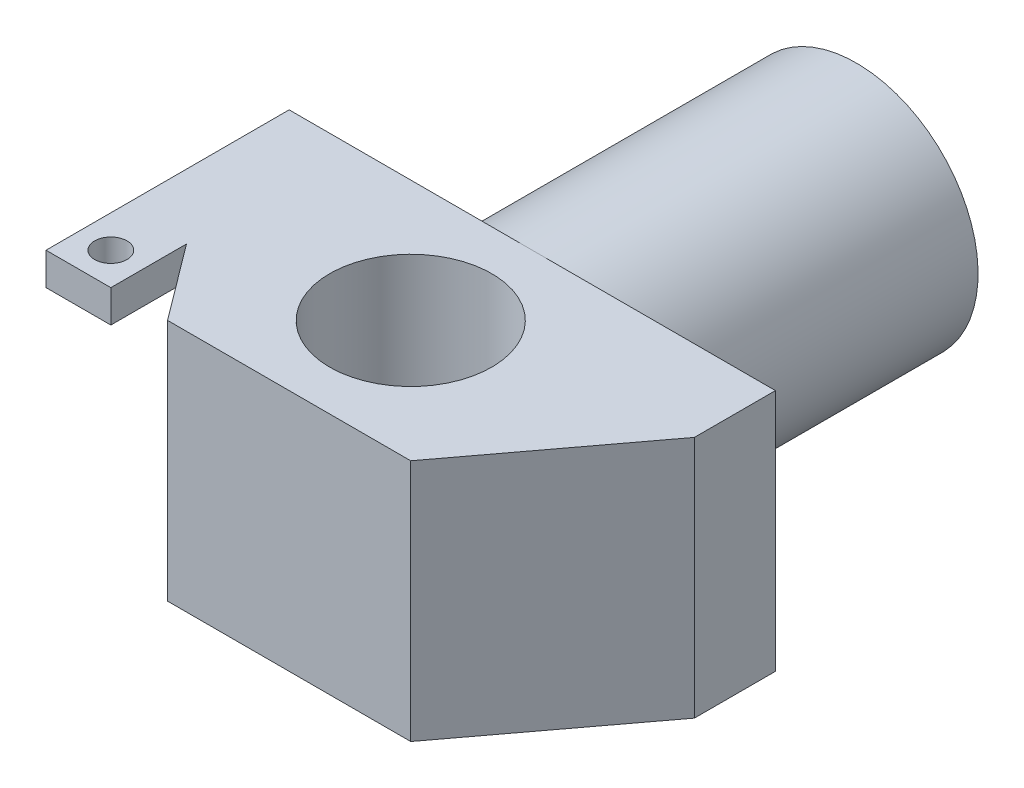
ISO-10303-21;
HEADER;
FILE_DESCRIPTION(('STEP AP214'),'2;1');
FILE_NAME('part.step','',(''),(''),'','','');
FILE_SCHEMA(('AUTOMOTIVE_DESIGN { 1 0 10303 214 1 1 1 1 }'));
ENDSEC;
DATA;
#1=APPLICATION_CONTEXT('core data for automotive mechanical design processes');
#2=APPLICATION_PROTOCOL_DEFINITION('international standard','automotive_design',2000,#1);
#3=PRODUCT_CONTEXT('',#1,'mechanical');
#4=PRODUCT('Part','Part','',(#3));
#5=PRODUCT_RELATED_PRODUCT_CATEGORY('part','',(#4));
#6=PRODUCT_DEFINITION_FORMATION('','',#4);
#7=PRODUCT_DEFINITION_CONTEXT('part definition',#1,'design');
#8=PRODUCT_DEFINITION('design','',#6,#7);
#9=PRODUCT_DEFINITION_SHAPE('','',#8);
#10=(LENGTH_UNIT() NAMED_UNIT(*) SI_UNIT(.MILLI.,.METRE.));
#11=(NAMED_UNIT(*) PLANE_ANGLE_UNIT() SI_UNIT($,.RADIAN.));
#12=(NAMED_UNIT(*) SI_UNIT($,.STERADIAN.) SOLID_ANGLE_UNIT());
#13=UNCERTAINTY_MEASURE_WITH_UNIT(LENGTH_MEASURE(1.E-05),#10,'distance_accuracy_value','');
#14=(GEOMETRIC_REPRESENTATION_CONTEXT(3) GLOBAL_UNCERTAINTY_ASSIGNED_CONTEXT((#13)) GLOBAL_UNIT_ASSIGNED_CONTEXT((#10,
#11,#12)) REPRESENTATION_CONTEXT('',''));
#15=CARTESIAN_POINT('',(0.,0.,0.));
#16=DIRECTION('',(0.,0.,1.));
#17=DIRECTION('',(1.,0.,0.));
#18=AXIS2_PLACEMENT_3D('',#15,#16,#17);
#19=CARTESIAN_POINT('',(-31.902827627041,7.5,23.1720895328567));
#20=DIRECTION('',(0.,0.,1.));
#21=DIRECTION('',(1.,0.,0.));
#22=AXIS2_PLACEMENT_3D('',#19,#20,#21);
#23=PLANE('',#22);
#24=CARTESIAN_POINT('',(-39.402827627041,3.75,23.1720895328567));
#25=DIRECTION('',(0.,0.,-1.));
#26=DIRECTION('',(-1.,0.,0.));
#27=AXIS2_PLACEMENT_3D('',#24,#25,#26);
#28=CIRCLE('',#27,3.75000000000001);
#29=CARTESIAN_POINT('',(-39.402827627041,7.50000000000001,23.1720895328567));
#30=VERTEX_POINT('',#29);
#31=CARTESIAN_POINT('',(-39.402827627041,0.,23.1720895328567));
#32=VERTEX_POINT('',#31);
#33=EDGE_CURVE('E152',#30,#32,#28,.T.);
#34=ORIENTED_EDGE('',*,*,#33,.F.);
#35=DIRECTION('',(-1.,0.,0.));
#36=VECTOR('',#35,1.);
#37=CARTESIAN_POINT('',(-31.902827627041,7.5,23.1720895328567));
#38=LINE('',#37,#36);
#39=CARTESIAN_POINT('',(-31.902827627041,7.5,23.1720895328567));
#40=VERTEX_POINT('',#39);
#41=EDGE_CURVE('E119',#40,#30,#38,.T.);
#42=ORIENTED_EDGE('',*,*,#41,.F.);
#43=DIRECTION('',(0.,-1.,0.));
#44=VECTOR('',#43,1.);
#45=CARTESIAN_POINT('',(-31.902827627041,7.5,23.1720895328567));
#46=LINE('',#45,#44);
#47=CARTESIAN_POINT('',(-31.902827627041,0.,23.1720895328567));
#48=VERTEX_POINT('',#47);
#49=EDGE_CURVE('E192',#40,#48,#46,.T.);
#50=ORIENTED_EDGE('',*,*,#49,.T.);
#51=DIRECTION('',(-1.,0.,0.));
#52=VECTOR('',#51,1.);
#53=CARTESIAN_POINT('',(-31.902827627041,0.,23.1720895328567));
#54=LINE('',#53,#52);
#55=EDGE_CURVE('E184',#48,#32,#54,.T.);
#56=ORIENTED_EDGE('',*,*,#55,.T.);
#57=EDGE_LOOP('',(#34,#42,#50,#56));
#58=FACE_BOUND('',#57,.T.);
#59=ADVANCED_FACE('F33',(#58),#23,.F.);
#60=CARTESIAN_POINT('',(-46.902827627041,0.,23.1720895328567));
#61=VERTEX_POINT('',#60);
#62=EDGE_CURVE('E183',#32,#61,#54,.T.);
#63=ORIENTED_EDGE('',*,*,#62,.T.);
#64=DIRECTION('',(0.,-1.,0.));
#65=VECTOR('',#64,1.);
#66=CARTESIAN_POINT('',(-46.902827627041,7.5,23.1720895328567));
#67=LINE('',#66,#65);
#68=CARTESIAN_POINT('',(-46.902827627041,7.5,23.1720895328567));
#69=VERTEX_POINT('',#68);
#70=EDGE_CURVE('E190',#69,#61,#67,.T.);
#71=ORIENTED_EDGE('',*,*,#70,.F.);
#72=EDGE_CURVE('E114',#30,#69,#38,.T.);
#73=ORIENTED_EDGE('',*,*,#72,.F.);
#74=EDGE_CURVE('E41',#32,#30,#28,.T.);
#75=ORIENTED_EDGE('',*,*,#74,.F.);
#76=EDGE_LOOP('',(#63,#71,#73,#75));
#77=FACE_BOUND('',#76,.T.);
#78=ADVANCED_FACE('F219',(#77),#23,.F.);
#79=CARTESIAN_POINT('',(0.,7.5,0.));
#80=DIRECTION('',(0.,1.,0.));
#81=DIRECTION('',(0.,0.,1.));
#82=AXIS2_PLACEMENT_3D('',#79,#80,#81);
#83=PLANE('',#82);
#84=CARTESIAN_POINT('',(-45.902827627041,7.5,29.6720895328567));
#85=DIRECTION('',(0.,1.,0.));
#86=DIRECTION('',(0.,0.,1.));
#87=AXIS2_PLACEMENT_3D('',#84,#85,#86);
#88=CIRCLE('',#87,0.499999999999999);
#89=CARTESIAN_POINT('',(-45.902827627041,7.5,30.1720895328567));
#90=VERTEX_POINT('',#89);
#91=EDGE_CURVE('E137',#90,#90,#88,.T.);
#92=ORIENTED_EDGE('',*,*,#91,.F.);
#93=EDGE_LOOP('',(#92));
#94=FACE_BOUND('',#93,.T.);
#95=ORIENTED_EDGE('',*,*,#72,.T.);
#96=DIRECTION('',(0.,0.,1.));
#97=VECTOR('',#96,1.);
#98=CARTESIAN_POINT('',(-46.902827627041,7.5,23.1720895328567));
#99=LINE('',#98,#97);
#100=CARTESIAN_POINT('',(-46.902827627041,7.5,30.6720895328567));
#101=VERTEX_POINT('',#100);
#102=EDGE_CURVE('E109',#69,#101,#99,.T.);
#103=ORIENTED_EDGE('',*,*,#102,.T.);
#104=DIRECTION('',(1.,0.,0.));
#105=VECTOR('',#104,1.);
#106=CARTESIAN_POINT('',(-46.902827627041,7.5,30.6720895328567));
#107=LINE('',#106,#105);
#108=CARTESIAN_POINT('',(-44.902827627041,7.5,30.6720895328567));
#109=VERTEX_POINT('',#108);
#110=EDGE_CURVE('E113',#101,#109,#107,.T.);
#111=ORIENTED_EDGE('',*,*,#110,.T.);
#112=DIRECTION('',(0.,0.,-1.));
#113=VECTOR('',#112,1.);
#114=CARTESIAN_POINT('',(-44.902827627041,7.5,30.6720895328567));
#115=LINE('',#114,#113);
#116=CARTESIAN_POINT('',(-44.902827627041,7.5,28.3387561995234));
#117=VERTEX_POINT('',#116);
#118=EDGE_CURVE('E48',#109,#117,#115,.T.);
#119=ORIENTED_EDGE('',*,*,#118,.T.);
#120=DIRECTION('',(0.599999999999999,0.,0.800000000000001));
#121=VECTOR('',#120,1.);
#122=CARTESIAN_POINT('',(-46.902827627041,7.5,25.6720895328567));
#123=LINE('',#122,#121);
#124=CARTESIAN_POINT('',(-43.152827627041,7.5,30.6720895328567));
#125=VERTEX_POINT('',#124);
#126=EDGE_CURVE('E165',#117,#125,#123,.T.);
#127=ORIENTED_EDGE('',*,*,#126,.T.);
#128=DIRECTION('',(1.,0.,0.));
#129=VECTOR('',#128,1.);
#130=CARTESIAN_POINT('',(-43.152827627041,7.5,30.6720895328567));
#131=LINE('',#130,#129);
#132=CARTESIAN_POINT('',(-35.652827627041,7.5,30.6720895328567));
#133=VERTEX_POINT('',#132);
#134=EDGE_CURVE('E167',#125,#133,#131,.T.);
#135=ORIENTED_EDGE('',*,*,#134,.T.);
#136=DIRECTION('',(0.6,0.,-0.8));
#137=VECTOR('',#136,1.);
#138=CARTESIAN_POINT('',(-35.652827627041,7.5,30.6720895328567));
#139=LINE('',#138,#137);
#140=CARTESIAN_POINT('',(-31.902827627041,7.5,25.6720895328567));
#141=VERTEX_POINT('',#140);
#142=EDGE_CURVE('E170',#133,#141,#139,.T.);
#143=ORIENTED_EDGE('',*,*,#142,.T.);
#144=DIRECTION('',(0.,0.,-1.));
#145=VECTOR('',#144,1.);
#146=CARTESIAN_POINT('',(-31.902827627041,7.5,25.6720895328567));
#147=LINE('',#146,#145);
#148=EDGE_CURVE('E172',#141,#40,#147,.T.);
#149=ORIENTED_EDGE('',*,*,#148,.T.);
#150=ORIENTED_EDGE('',*,*,#41,.T.);
#151=EDGE_LOOP('',(#95,#103,#111,#119,#127,#135,#143,#149,#150));
#152=FACE_BOUND('',#151,.T.);
#153=CARTESIAN_POINT('',(-39.402827627041,7.5,26.9220895328567));
#154=DIRECTION('',(0.,1.,0.));
#155=DIRECTION('',(0.,0.,1.));
#156=AXIS2_PLACEMENT_3D('',#153,#154,#155);
#157=CIRCLE('',#156,2.5);
#158=CARTESIAN_POINT('',(-39.402827627041,7.5,29.4220895328567));
#159=VERTEX_POINT('',#158);
#160=EDGE_CURVE('E159',#159,#159,#157,.T.);
#161=ORIENTED_EDGE('',*,*,#160,.F.);
#162=EDGE_LOOP('',(#161));
#163=FACE_BOUND('',#162,.T.);
#164=ADVANCED_FACE('F111',(#94,#152,#163),#83,.T.);
#165=CARTESIAN_POINT('',(0.,0.,0.));
#166=DIRECTION('',(0.,1.,0.));
#167=DIRECTION('',(0.,0.,1.));
#168=AXIS2_PLACEMENT_3D('',#165,#166,#167);
#169=PLANE('',#168);
#170=DIRECTION('',(0.599999999999999,0.,0.800000000000001));
#171=VECTOR('',#170,1.);
#172=CARTESIAN_POINT('',(-46.902827627041,0.,25.6720895328567));
#173=LINE('',#172,#171);
#174=CARTESIAN_POINT('',(-46.902827627041,0.,25.6720895328567));
#175=VERTEX_POINT('',#174);
#176=CARTESIAN_POINT('',(-43.152827627041,0.,30.6720895328567));
#177=VERTEX_POINT('',#176);
#178=EDGE_CURVE('E162',#175,#177,#173,.T.);
#179=ORIENTED_EDGE('',*,*,#178,.F.);
#180=DIRECTION('',(0.,0.,1.));
#181=VECTOR('',#180,1.);
#182=CARTESIAN_POINT('',(-46.902827627041,0.,23.1720895328567));
#183=LINE('',#182,#181);
#184=EDGE_CURVE('E168',#61,#175,#183,.T.);
#185=ORIENTED_EDGE('',*,*,#184,.F.);
#186=ORIENTED_EDGE('',*,*,#62,.F.);
#187=ORIENTED_EDGE('',*,*,#55,.F.);
#188=DIRECTION('',(0.,0.,-1.));
#189=VECTOR('',#188,1.);
#190=CARTESIAN_POINT('',(-31.902827627041,0.,25.6720895328567));
#191=LINE('',#190,#189);
#192=CARTESIAN_POINT('',(-31.902827627041,0.,25.6720895328567));
#193=VERTEX_POINT('',#192);
#194=EDGE_CURVE('E181',#193,#48,#191,.T.);
#195=ORIENTED_EDGE('',*,*,#194,.F.);
#196=DIRECTION('',(0.6,0.,-0.8));
#197=VECTOR('',#196,1.);
#198=CARTESIAN_POINT('',(-35.652827627041,0.,30.6720895328567));
#199=LINE('',#198,#197);
#200=CARTESIAN_POINT('',(-35.652827627041,0.,30.6720895328567));
#201=VERTEX_POINT('',#200);
#202=EDGE_CURVE('E179',#201,#193,#199,.T.);
#203=ORIENTED_EDGE('',*,*,#202,.F.);
#204=DIRECTION('',(1.,0.,0.));
#205=VECTOR('',#204,1.);
#206=CARTESIAN_POINT('',(-43.152827627041,0.,30.6720895328567));
#207=LINE('',#206,#205);
#208=EDGE_CURVE('E177',#177,#201,#207,.T.);
#209=ORIENTED_EDGE('',*,*,#208,.F.);
#210=EDGE_LOOP('',(#179,#185,#186,#187,#195,#203,#209));
#211=FACE_BOUND('',#210,.T.);
#212=CARTESIAN_POINT('',(-39.402827627041,0.,26.9220895328567));
#213=DIRECTION('',(0.,1.,0.));
#214=DIRECTION('',(0.,0.,1.));
#215=AXIS2_PLACEMENT_3D('',#212,#213,#214);
#216=CIRCLE('',#215,2.5);
#217=CARTESIAN_POINT('',(-39.402827627041,0.,29.4220895328567));
#218=VERTEX_POINT('',#217);
#219=EDGE_CURVE('E156',#218,#218,#216,.T.);
#220=ORIENTED_EDGE('',*,*,#219,.T.);
#221=EDGE_LOOP('',(#220));
#222=FACE_BOUND('',#221,.T.);
#223=ADVANCED_FACE('F215',(#211,#222),#169,.F.);
#224=CARTESIAN_POINT('',(-46.902827627041,7.5,25.6720895328567));
#225=DIRECTION('',(0.800000000000001,0.,-0.599999999999999));
#226=DIRECTION('',(-0.599999999999999,0.,-0.800000000000001));
#227=AXIS2_PLACEMENT_3D('',#224,#225,#226);
#228=PLANE('',#227);
#229=DIRECTION('',(0.,-1.,0.));
#230=VECTOR('',#229,1.);
#231=CARTESIAN_POINT('',(-44.902827627041,7.5,28.3387561995234));
#232=LINE('',#231,#230);
#233=CARTESIAN_POINT('',(-44.902827627041,6.5,28.3387561995234));
#234=VERTEX_POINT('',#233);
#235=EDGE_CURVE('E11',#117,#234,#232,.T.);
#236=ORIENTED_EDGE('',*,*,#235,.T.);
#237=DIRECTION('',(-0.599999999999999,0.,-0.800000000000001));
#238=VECTOR('',#237,1.);
#239=CARTESIAN_POINT('',(-46.902827627041,6.5,25.6720895328567));
#240=LINE('',#239,#238);
#241=CARTESIAN_POINT('',(-46.902827627041,6.5,25.6720895328567));
#242=VERTEX_POINT('',#241);
#243=EDGE_CURVE('E145',#234,#242,#240,.T.);
#244=ORIENTED_EDGE('',*,*,#243,.T.);
#245=DIRECTION('',(0.,-1.,0.));
#246=VECTOR('',#245,1.);
#247=CARTESIAN_POINT('',(-46.902827627041,7.5,25.6720895328567));
#248=LINE('',#247,#246);
#249=EDGE_CURVE('E118',#242,#175,#248,.T.);
#250=ORIENTED_EDGE('',*,*,#249,.T.);
#251=ORIENTED_EDGE('',*,*,#178,.T.);
#252=DIRECTION('',(0.,-1.,0.));
#253=VECTOR('',#252,1.);
#254=CARTESIAN_POINT('',(-43.152827627041,7.5,30.6720895328567));
#255=LINE('',#254,#253);
#256=EDGE_CURVE('E200',#125,#177,#255,.T.);
#257=ORIENTED_EDGE('',*,*,#256,.F.);
#258=ORIENTED_EDGE('',*,*,#126,.F.);
#259=EDGE_LOOP('',(#236,#244,#250,#251,#257,#258));
#260=FACE_BOUND('',#259,.T.);
#261=ADVANCED_FACE('F35',(#260),#228,.F.);
#262=CARTESIAN_POINT('',(-43.152827627041,7.5,30.6720895328567));
#263=DIRECTION('',(0.,0.,-1.));
#264=DIRECTION('',(-1.,0.,0.));
#265=AXIS2_PLACEMENT_3D('',#262,#263,#264);
#266=PLANE('',#265);
#267=ORIENTED_EDGE('',*,*,#208,.T.);
#268=DIRECTION('',(0.,-1.,0.));
#269=VECTOR('',#268,1.);
#270=CARTESIAN_POINT('',(-35.652827627041,7.5,30.6720895328567));
#271=LINE('',#270,#269);
#272=EDGE_CURVE('E198',#133,#201,#271,.T.);
#273=ORIENTED_EDGE('',*,*,#272,.F.);
#274=ORIENTED_EDGE('',*,*,#134,.F.);
#275=ORIENTED_EDGE('',*,*,#256,.T.);
#276=EDGE_LOOP('',(#267,#273,#274,#275));
#277=FACE_BOUND('',#276,.T.);
#278=ADVANCED_FACE('F227',(#277),#266,.F.);
#279=CARTESIAN_POINT('',(-35.652827627041,7.5,30.6720895328567));
#280=DIRECTION('',(-0.8,0.,-0.6));
#281=DIRECTION('',(-0.6,0.,0.8));
#282=AXIS2_PLACEMENT_3D('',#279,#280,#281);
#283=PLANE('',#282);
#284=ORIENTED_EDGE('',*,*,#202,.T.);
#285=DIRECTION('',(0.,-1.,0.));
#286=VECTOR('',#285,1.);
#287=CARTESIAN_POINT('',(-31.902827627041,7.5,25.6720895328567));
#288=LINE('',#287,#286);
#289=EDGE_CURVE('E195',#141,#193,#288,.T.);
#290=ORIENTED_EDGE('',*,*,#289,.F.);
#291=ORIENTED_EDGE('',*,*,#142,.F.);
#292=ORIENTED_EDGE('',*,*,#272,.T.);
#293=EDGE_LOOP('',(#284,#290,#291,#292));
#294=FACE_BOUND('',#293,.T.);
#295=ADVANCED_FACE('F231',(#294),#283,.F.);
#296=CARTESIAN_POINT('',(-31.902827627041,7.5,25.6720895328567));
#297=DIRECTION('',(-1.,0.,0.));
#298=DIRECTION('',(0.,0.,1.));
#299=AXIS2_PLACEMENT_3D('',#296,#297,#298);
#300=PLANE('',#299);
#301=ORIENTED_EDGE('',*,*,#194,.T.);
#302=ORIENTED_EDGE('',*,*,#49,.F.);
#303=ORIENTED_EDGE('',*,*,#148,.F.);
#304=ORIENTED_EDGE('',*,*,#289,.T.);
#305=EDGE_LOOP('',(#301,#302,#303,#304));
#306=FACE_BOUND('',#305,.T.);
#307=ADVANCED_FACE('F234',(#306),#300,.F.);
#308=CARTESIAN_POINT('',(-46.902827627041,7.5,23.1720895328567));
#309=DIRECTION('',(1.,0.,0.));
#310=DIRECTION('',(0.,0.,-1.));
#311=AXIS2_PLACEMENT_3D('',#308,#309,#310);
#312=PLANE('',#311);
#313=ORIENTED_EDGE('',*,*,#249,.F.);
#314=DIRECTION('',(0.,0.,-1.));
#315=VECTOR('',#314,1.);
#316=CARTESIAN_POINT('',(-46.902827627041,6.5,30.6720895328567));
#317=LINE('',#316,#315);
#318=CARTESIAN_POINT('',(-46.902827627041,6.5,30.6720895328567));
#319=VERTEX_POINT('',#318);
#320=EDGE_CURVE('E133',#319,#242,#317,.T.);
#321=ORIENTED_EDGE('',*,*,#320,.F.);
#322=DIRECTION('',(0.,1.,0.));
#323=VECTOR('',#322,1.);
#324=CARTESIAN_POINT('',(-46.902827627041,7.5,30.6720895328567));
#325=LINE('',#324,#323);
#326=EDGE_CURVE('E126',#319,#101,#325,.T.);
#327=ORIENTED_EDGE('',*,*,#326,.T.);
#328=ORIENTED_EDGE('',*,*,#102,.F.);
#329=ORIENTED_EDGE('',*,*,#70,.T.);
#330=ORIENTED_EDGE('',*,*,#184,.T.);
#331=EDGE_LOOP('',(#313,#321,#327,#328,#329,#330));
#332=FACE_BOUND('',#331,.T.);
#333=ADVANCED_FACE('F132',(#332),#312,.F.);
#334=CARTESIAN_POINT('',(-39.402827627041,7.5,26.9220895328567));
#335=DIRECTION('',(0.,-1.,0.));
#336=DIRECTION('',(0.,0.,-1.));
#337=AXIS2_PLACEMENT_3D('',#334,#335,#336);
#338=CYLINDRICAL_SURFACE('',#337,2.5);
#339=ORIENTED_EDGE('',*,*,#160,.T.);
#340=EDGE_LOOP('',(#339));
#341=FACE_BOUND('',#340,.T.);
#342=ORIENTED_EDGE('',*,*,#219,.F.);
#343=EDGE_LOOP('',(#342));
#344=FACE_BOUND('',#343,.T.);
#345=ADVANCED_FACE('F241',(#341,#344),#338,.F.);
#346=CARTESIAN_POINT('',(-39.402827627041,3.75,13.1720895328567));
#347=DIRECTION('',(0.,0.,1.));
#348=DIRECTION('',(1.,0.,0.));
#349=AXIS2_PLACEMENT_3D('',#346,#347,#348);
#350=CYLINDRICAL_SURFACE('',#349,3.75000000000001);
#351=CARTESIAN_POINT('',(-39.402827627041,3.75,13.1720895328567));
#352=DIRECTION('',(0.,0.,-1.));
#353=DIRECTION('',(-1.,0.,0.));
#354=AXIS2_PLACEMENT_3D('',#351,#352,#353);
#355=CIRCLE('',#354,3.75000000000001);
#356=CARTESIAN_POINT('',(-43.152827627041,3.75,13.1720895328567));
#357=VERTEX_POINT('',#356);
#358=EDGE_CURVE('E153',#357,#357,#355,.T.);
#359=ORIENTED_EDGE('',*,*,#358,.F.);
#360=EDGE_LOOP('',(#359));
#361=FACE_BOUND('',#360,.T.);
#362=ORIENTED_EDGE('',*,*,#33,.T.);
#363=ORIENTED_EDGE('',*,*,#74,.T.);
#364=EDGE_LOOP('',(#362,#363));
#365=FACE_BOUND('',#364,.T.);
#366=ADVANCED_FACE('F206',(#361,#365),#350,.T.);
#367=CARTESIAN_POINT('',(-39.402827627041,3.75,13.1720895328567));
#368=DIRECTION('',(0.,0.,-1.));
#369=DIRECTION('',(-1.,0.,0.));
#370=AXIS2_PLACEMENT_3D('',#367,#368,#369);
#371=PLANE('',#370);
#372=ORIENTED_EDGE('',*,*,#358,.T.);
#373=EDGE_LOOP('',(#372));
#374=FACE_BOUND('',#373,.T.);
#375=ADVANCED_FACE('F260',(#374),#371,.T.);
#376=CARTESIAN_POINT('',(-44.902827627041,7.5,30.6720895328567));
#377=DIRECTION('',(1.,0.,0.));
#378=DIRECTION('',(0.,0.,-1.));
#379=AXIS2_PLACEMENT_3D('',#376,#377,#378);
#380=PLANE('',#379);
#381=ORIENTED_EDGE('',*,*,#235,.F.);
#382=ORIENTED_EDGE('',*,*,#118,.F.);
#383=DIRECTION('',(0.,-1.,0.));
#384=VECTOR('',#383,1.);
#385=CARTESIAN_POINT('',(-44.902827627041,7.5,30.6720895328567));
#386=LINE('',#385,#384);
#387=CARTESIAN_POINT('',(-44.902827627041,6.5,30.6720895328567));
#388=VERTEX_POINT('',#387);
#389=EDGE_CURVE('E129',#109,#388,#386,.T.);
#390=ORIENTED_EDGE('',*,*,#389,.T.);
#391=DIRECTION('',(0.,0.,-1.));
#392=VECTOR('',#391,1.);
#393=CARTESIAN_POINT('',(-44.902827627041,6.5,30.6720895328567));
#394=LINE('',#393,#392);
#395=EDGE_CURVE('E146',#388,#234,#394,.T.);
#396=ORIENTED_EDGE('',*,*,#395,.T.);
#397=EDGE_LOOP('',(#381,#382,#390,#396));
#398=FACE_BOUND('',#397,.T.);
#399=ADVANCED_FACE('F225',(#398),#380,.T.);
#400=CARTESIAN_POINT('',(-46.902827627041,6.5,30.6720895328567));
#401=DIRECTION('',(0.,-1.,0.));
#402=DIRECTION('',(0.,0.,-1.));
#403=AXIS2_PLACEMENT_3D('',#400,#401,#402);
#404=PLANE('',#403);
#405=CARTESIAN_POINT('',(-45.902827627041,6.5,29.6720895328567));
#406=DIRECTION('',(0.,1.,0.));
#407=DIRECTION('',(0.,0.,1.));
#408=AXIS2_PLACEMENT_3D('',#405,#406,#407);
#409=CIRCLE('',#408,0.499999999999999);
#410=CARTESIAN_POINT('',(-45.902827627041,6.5,30.1720895328567));
#411=VERTEX_POINT('',#410);
#412=EDGE_CURVE('E134',#411,#411,#409,.T.);
#413=ORIENTED_EDGE('',*,*,#412,.T.);
#414=EDGE_LOOP('',(#413));
#415=FACE_BOUND('',#414,.T.);
#416=ORIENTED_EDGE('',*,*,#243,.F.);
#417=ORIENTED_EDGE('',*,*,#395,.F.);
#418=DIRECTION('',(-1.,0.,0.));
#419=VECTOR('',#418,1.);
#420=CARTESIAN_POINT('',(-46.902827627041,6.5,30.6720895328567));
#421=LINE('',#420,#419);
#422=EDGE_CURVE('E142',#388,#319,#421,.T.);
#423=ORIENTED_EDGE('',*,*,#422,.T.);
#424=ORIENTED_EDGE('',*,*,#320,.T.);
#425=EDGE_LOOP('',(#416,#417,#423,#424));
#426=FACE_BOUND('',#425,.T.);
#427=ADVANCED_FACE('F223',(#415,#426),#404,.T.);
#428=CARTESIAN_POINT('',(0.,0.,30.6720895328567));
#429=DIRECTION('',(0.,0.,1.));
#430=DIRECTION('',(1.,0.,0.));
#431=AXIS2_PLACEMENT_3D('',#428,#429,#430);
#432=PLANE('',#431);
#433=ORIENTED_EDGE('',*,*,#326,.F.);
#434=ORIENTED_EDGE('',*,*,#422,.F.);
#435=ORIENTED_EDGE('',*,*,#389,.F.);
#436=ORIENTED_EDGE('',*,*,#110,.F.);
#437=EDGE_LOOP('',(#433,#434,#435,#436));
#438=FACE_BOUND('',#437,.T.);
#439=ADVANCED_FACE('F124',(#438),#432,.T.);
#440=CARTESIAN_POINT('',(-45.902827627041,6.5,29.6720895328567));
#441=DIRECTION('',(0.,1.,0.));
#442=DIRECTION('',(0.,0.,1.));
#443=AXIS2_PLACEMENT_3D('',#440,#441,#442);
#444=CYLINDRICAL_SURFACE('',#443,0.499999999999999);
#445=ORIENTED_EDGE('',*,*,#412,.F.);
#446=EDGE_LOOP('',(#445));
#447=FACE_BOUND('',#446,.T.);
#448=ORIENTED_EDGE('',*,*,#91,.T.);
#449=EDGE_LOOP('',(#448));
#450=FACE_BOUND('',#449,.T.);
#451=ADVANCED_FACE('F272',(#447,#450),#444,.F.);
#452=CLOSED_SHELL('',(#59,#78,#164,#223,#261,#278,#295,#307,#333,#345,#366,#375,#399,#427,#439,#451));
#453=MANIFOLD_SOLID_BREP('B2',#452);
#454=ADVANCED_BREP_SHAPE_REPRESENTATION('',(#18,#453),#14);
#455=SHAPE_DEFINITION_REPRESENTATION(#9,#454);
ENDSEC;
END-ISO-10303-21;
